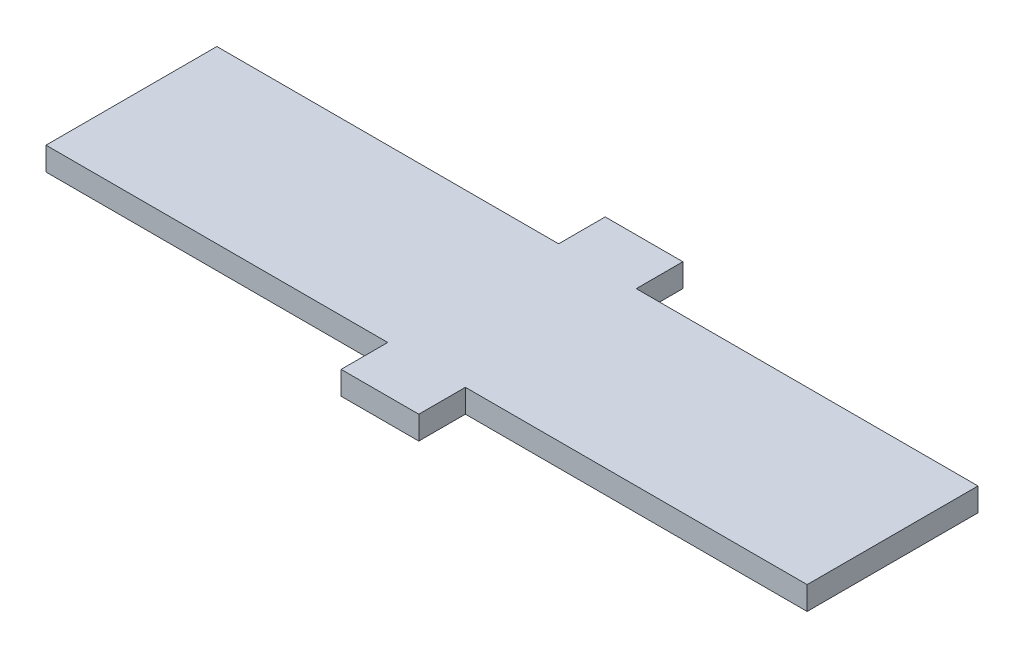
ISO-10303-21;
HEADER;
FILE_DESCRIPTION(('STEP AP214'),'2;1');
FILE_NAME('part.step','',(''),(''),'','','');
FILE_SCHEMA(('AUTOMOTIVE_DESIGN { 1 0 10303 214 1 1 1 1 }'));
ENDSEC;
DATA;
#1=APPLICATION_CONTEXT('core data for automotive mechanical design processes');
#2=APPLICATION_PROTOCOL_DEFINITION('international standard','automotive_design',2000,#1);
#3=PRODUCT_CONTEXT('',#1,'mechanical');
#4=PRODUCT('Part','Part','',(#3));
#5=PRODUCT_RELATED_PRODUCT_CATEGORY('part','',(#4));
#6=PRODUCT_DEFINITION_FORMATION('','',#4);
#7=PRODUCT_DEFINITION_CONTEXT('part definition',#1,'design');
#8=PRODUCT_DEFINITION('design','',#6,#7);
#9=PRODUCT_DEFINITION_SHAPE('','',#8);
#10=(LENGTH_UNIT() NAMED_UNIT(*) SI_UNIT(.MILLI.,.METRE.));
#11=(NAMED_UNIT(*) PLANE_ANGLE_UNIT() SI_UNIT($,.RADIAN.));
#12=(NAMED_UNIT(*) SI_UNIT($,.STERADIAN.) SOLID_ANGLE_UNIT());
#13=UNCERTAINTY_MEASURE_WITH_UNIT(LENGTH_MEASURE(1.E-05),#10,'distance_accuracy_value','');
#14=(GEOMETRIC_REPRESENTATION_CONTEXT(3) GLOBAL_UNCERTAINTY_ASSIGNED_CONTEXT((#13)) GLOBAL_UNIT_ASSIGNED_CONTEXT((#10,
#11,#12)) REPRESENTATION_CONTEXT('',''));
#15=CARTESIAN_POINT('',(0.,0.,0.));
#16=DIRECTION('',(0.,0.,1.));
#17=DIRECTION('',(1.,0.,0.));
#18=AXIS2_PLACEMENT_3D('',#15,#16,#17);
#19=CARTESIAN_POINT('',(-24.5,1.5,5.5));
#20=DIRECTION('',(0.,0.,-1.));
#21=DIRECTION('',(-1.,0.,0.));
#22=AXIS2_PLACEMENT_3D('',#19,#20,#21);
#23=PLANE('',#22);
#24=DIRECTION('',(0.,1.,0.));
#25=VECTOR('',#24,1.);
#26=CARTESIAN_POINT('',(2.49999999999999,0.,5.5));
#27=LINE('',#26,#25);
#28=CARTESIAN_POINT('',(2.49999999999999,0.,5.5));
#29=VERTEX_POINT('',#28);
#30=CARTESIAN_POINT('',(2.49999999999999,1.5,5.5));
#31=VERTEX_POINT('',#30);
#32=EDGE_CURVE('E160',#29,#31,#27,.T.);
#33=ORIENTED_EDGE('',*,*,#32,.F.);
#34=DIRECTION('',(1.,0.,0.));
#35=VECTOR('',#34,1.);
#36=CARTESIAN_POINT('',(-24.5,0.,5.5));
#37=LINE('',#36,#35);
#38=CARTESIAN_POINT('',(24.5,0.,5.5));
#39=VERTEX_POINT('',#38);
#40=EDGE_CURVE('E209',#29,#39,#37,.T.);
#41=ORIENTED_EDGE('',*,*,#40,.T.);
#42=DIRECTION('',(0.,-1.,0.));
#43=VECTOR('',#42,1.);
#44=CARTESIAN_POINT('',(24.5,1.5,5.5));
#45=LINE('',#44,#43);
#46=CARTESIAN_POINT('',(24.5,1.5,5.5));
#47=VERTEX_POINT('',#46);
#48=EDGE_CURVE('E200',#47,#39,#45,.T.);
#49=ORIENTED_EDGE('',*,*,#48,.F.);
#50=DIRECTION('',(1.,0.,0.));
#51=VECTOR('',#50,1.);
#52=CARTESIAN_POINT('',(-24.5,1.5,5.5));
#53=LINE('',#52,#51);
#54=EDGE_CURVE('E196',#31,#47,#53,.T.);
#55=ORIENTED_EDGE('',*,*,#54,.F.);
#56=EDGE_LOOP('',(#33,#41,#49,#55));
#57=FACE_BOUND('',#56,.T.);
#58=ADVANCED_FACE('F39',(#57),#23,.F.);
#59=CARTESIAN_POINT('',(-24.5,1.5,-5.5));
#60=DIRECTION('',(0.,0.,1.));
#61=DIRECTION('',(1.,0.,0.));
#62=AXIS2_PLACEMENT_3D('',#59,#60,#61);
#63=PLANE('',#62);
#64=DIRECTION('',(0.,1.,0.));
#65=VECTOR('',#64,1.);
#66=CARTESIAN_POINT('',(-2.50000000000001,0.,-5.5));
#67=LINE('',#66,#65);
#68=CARTESIAN_POINT('',(-2.50000000000001,0.,-5.5));
#69=VERTEX_POINT('',#68);
#70=CARTESIAN_POINT('',(-2.50000000000001,1.5,-5.5));
#71=VERTEX_POINT('',#70);
#72=EDGE_CURVE('E172',#69,#71,#67,.T.);
#73=ORIENTED_EDGE('',*,*,#72,.F.);
#74=DIRECTION('',(-1.,0.,0.));
#75=VECTOR('',#74,1.);
#76=CARTESIAN_POINT('',(-24.5,0.,-5.5));
#77=LINE('',#76,#75);
#78=CARTESIAN_POINT('',(-24.5,0.,-5.5));
#79=VERTEX_POINT('',#78);
#80=EDGE_CURVE('E203',#69,#79,#77,.T.);
#81=ORIENTED_EDGE('',*,*,#80,.T.);
#82=DIRECTION('',(0.,-1.,0.));
#83=VECTOR('',#82,1.);
#84=CARTESIAN_POINT('',(-24.5,1.5,-5.5));
#85=LINE('',#84,#83);
#86=CARTESIAN_POINT('',(-24.5,1.5,-5.5));
#87=VERTEX_POINT('',#86);
#88=EDGE_CURVE('E47',#87,#79,#85,.T.);
#89=ORIENTED_EDGE('',*,*,#88,.F.);
#90=DIRECTION('',(-1.,0.,0.));
#91=VECTOR('',#90,1.);
#92=CARTESIAN_POINT('',(-24.5,1.5,-5.5));
#93=LINE('',#92,#91);
#94=EDGE_CURVE('E189',#71,#87,#93,.T.);
#95=ORIENTED_EDGE('',*,*,#94,.F.);
#96=EDGE_LOOP('',(#73,#81,#89,#95));
#97=FACE_BOUND('',#96,.T.);
#98=ADVANCED_FACE('F233',(#97),#63,.F.);
#99=CARTESIAN_POINT('',(24.5,1.5,5.5));
#100=DIRECTION('',(-1.,0.,0.));
#101=DIRECTION('',(0.,0.,1.));
#102=AXIS2_PLACEMENT_3D('',#99,#100,#101);
#103=PLANE('',#102);
#104=DIRECTION('',(0.,0.,-1.));
#105=VECTOR('',#104,1.);
#106=CARTESIAN_POINT('',(24.5,0.,5.5));
#107=LINE('',#106,#105);
#108=CARTESIAN_POINT('',(24.5,0.,-5.5));
#109=VERTEX_POINT('',#108);
#110=EDGE_CURVE('E180',#39,#109,#107,.T.);
#111=ORIENTED_EDGE('',*,*,#110,.T.);
#112=DIRECTION('',(0.,-1.,0.));
#113=VECTOR('',#112,1.);
#114=CARTESIAN_POINT('',(24.5,1.5,-5.5));
#115=LINE('',#114,#113);
#116=CARTESIAN_POINT('',(24.5,1.5,-5.5));
#117=VERTEX_POINT('',#116);
#118=EDGE_CURVE('E11',#117,#109,#115,.T.);
#119=ORIENTED_EDGE('',*,*,#118,.F.);
#120=DIRECTION('',(0.,0.,-1.));
#121=VECTOR('',#120,1.);
#122=CARTESIAN_POINT('',(24.5,1.5,5.5));
#123=LINE('',#122,#121);
#124=EDGE_CURVE('E186',#47,#117,#123,.T.);
#125=ORIENTED_EDGE('',*,*,#124,.F.);
#126=ORIENTED_EDGE('',*,*,#48,.T.);
#127=EDGE_LOOP('',(#111,#119,#125,#126));
#128=FACE_BOUND('',#127,.T.);
#129=ADVANCED_FACE('F41',(#128),#103,.F.);
#130=CARTESIAN_POINT('',(2.49999999999999,0.,-5.5));
#131=VERTEX_POINT('',#130);
#132=EDGE_CURVE('E204',#109,#131,#77,.T.);
#133=ORIENTED_EDGE('',*,*,#132,.T.);
#134=DIRECTION('',(0.,1.,0.));
#135=VECTOR('',#134,1.);
#136=CARTESIAN_POINT('',(2.49999999999999,0.,-5.5));
#137=LINE('',#136,#135);
#138=CARTESIAN_POINT('',(2.49999999999999,1.5,-5.5));
#139=VERTEX_POINT('',#138);
#140=EDGE_CURVE('E183',#131,#139,#137,.T.);
#141=ORIENTED_EDGE('',*,*,#140,.T.);
#142=EDGE_CURVE('E191',#117,#139,#93,.T.);
#143=ORIENTED_EDGE('',*,*,#142,.F.);
#144=ORIENTED_EDGE('',*,*,#118,.T.);
#145=EDGE_LOOP('',(#133,#141,#143,#144));
#146=FACE_BOUND('',#145,.T.);
#147=ADVANCED_FACE('F243',(#146),#63,.F.);
#148=CARTESIAN_POINT('',(-24.5,1.5,5.5));
#149=DIRECTION('',(1.,0.,0.));
#150=DIRECTION('',(0.,0.,-1.));
#151=AXIS2_PLACEMENT_3D('',#148,#149,#150);
#152=PLANE('',#151);
#153=DIRECTION('',(0.,0.,1.));
#154=VECTOR('',#153,1.);
#155=CARTESIAN_POINT('',(-24.5,0.,5.5));
#156=LINE('',#155,#154);
#157=CARTESIAN_POINT('',(-24.5,0.,5.5));
#158=VERTEX_POINT('',#157);
#159=EDGE_CURVE('E207',#79,#158,#156,.T.);
#160=ORIENTED_EDGE('',*,*,#159,.T.);
#161=DIRECTION('',(0.,-1.,0.));
#162=VECTOR('',#161,1.);
#163=CARTESIAN_POINT('',(-24.5,1.5,5.5));
#164=LINE('',#163,#162);
#165=CARTESIAN_POINT('',(-24.5,1.5,5.5));
#166=VERTEX_POINT('',#165);
#167=EDGE_CURVE('E213',#166,#158,#164,.T.);
#168=ORIENTED_EDGE('',*,*,#167,.F.);
#169=DIRECTION('',(0.,0.,1.));
#170=VECTOR('',#169,1.);
#171=CARTESIAN_POINT('',(-24.5,1.5,5.5));
#172=LINE('',#171,#170);
#173=EDGE_CURVE('E194',#87,#166,#172,.T.);
#174=ORIENTED_EDGE('',*,*,#173,.F.);
#175=ORIENTED_EDGE('',*,*,#88,.T.);
#176=EDGE_LOOP('',(#160,#168,#174,#175));
#177=FACE_BOUND('',#176,.T.);
#178=ADVANCED_FACE('F220',(#177),#152,.F.);
#179=CARTESIAN_POINT('',(-2.50000000000001,0.,5.5));
#180=VERTEX_POINT('',#179);
#181=EDGE_CURVE('E190',#158,#180,#37,.T.);
#182=ORIENTED_EDGE('',*,*,#181,.T.);
#183=DIRECTION('',(0.,1.,0.));
#184=VECTOR('',#183,1.);
#185=CARTESIAN_POINT('',(-2.50000000000001,0.,5.5));
#186=LINE('',#185,#184);
#187=CARTESIAN_POINT('',(-2.50000000000001,1.5,5.5));
#188=VERTEX_POINT('',#187);
#189=EDGE_CURVE('E149',#180,#188,#186,.T.);
#190=ORIENTED_EDGE('',*,*,#189,.T.);
#191=EDGE_CURVE('E197',#166,#188,#53,.T.);
#192=ORIENTED_EDGE('',*,*,#191,.F.);
#193=ORIENTED_EDGE('',*,*,#167,.T.);
#194=EDGE_LOOP('',(#182,#190,#192,#193));
#195=FACE_BOUND('',#194,.T.);
#196=ADVANCED_FACE('F227',(#195),#23,.F.);
#197=CARTESIAN_POINT('',(0.,1.5,0.));
#198=DIRECTION('',(0.,-1.,0.));
#199=DIRECTION('',(0.,0.,-1.));
#200=AXIS2_PLACEMENT_3D('',#197,#198,#199);
#201=PLANE('',#200);
#202=ORIENTED_EDGE('',*,*,#124,.T.);
#203=ORIENTED_EDGE('',*,*,#142,.T.);
#204=DIRECTION('',(0.,0.,-1.));
#205=VECTOR('',#204,1.);
#206=CARTESIAN_POINT('',(2.49999999999999,1.5,-5.5));
#207=LINE('',#206,#205);
#208=CARTESIAN_POINT('',(2.49999999999999,1.5,-8.5));
#209=VERTEX_POINT('',#208);
#210=EDGE_CURVE('E62',#139,#209,#207,.T.);
#211=ORIENTED_EDGE('',*,*,#210,.T.);
#212=DIRECTION('',(-1.,0.,0.));
#213=VECTOR('',#212,1.);
#214=CARTESIAN_POINT('',(-2.50000000000001,1.5,-8.5));
#215=LINE('',#214,#213);
#216=CARTESIAN_POINT('',(-2.50000000000001,1.5,-8.5));
#217=VERTEX_POINT('',#216);
#218=EDGE_CURVE('E166',#209,#217,#215,.T.);
#219=ORIENTED_EDGE('',*,*,#218,.T.);
#220=DIRECTION('',(0.,0.,1.));
#221=VECTOR('',#220,1.);
#222=CARTESIAN_POINT('',(-2.50000000000001,1.5,-5.5));
#223=LINE('',#222,#221);
#224=EDGE_CURVE('E159',#217,#71,#223,.T.);
#225=ORIENTED_EDGE('',*,*,#224,.T.);
#226=ORIENTED_EDGE('',*,*,#94,.T.);
#227=ORIENTED_EDGE('',*,*,#173,.T.);
#228=ORIENTED_EDGE('',*,*,#191,.T.);
#229=DIRECTION('',(0.,0.,1.));
#230=VECTOR('',#229,1.);
#231=CARTESIAN_POINT('',(-2.50000000000001,1.5,5.5));
#232=LINE('',#231,#230);
#233=CARTESIAN_POINT('',(-2.50000000000001,1.5,8.5));
#234=VERTEX_POINT('',#233);
#235=EDGE_CURVE('E54',#188,#234,#232,.T.);
#236=ORIENTED_EDGE('',*,*,#235,.T.);
#237=DIRECTION('',(1.,0.,0.));
#238=VECTOR('',#237,1.);
#239=CARTESIAN_POINT('',(-2.50000000000001,1.5,8.5));
#240=LINE('',#239,#238);
#241=CARTESIAN_POINT('',(2.49999999999999,1.5,8.5));
#242=VERTEX_POINT('',#241);
#243=EDGE_CURVE('E133',#234,#242,#240,.T.);
#244=ORIENTED_EDGE('',*,*,#243,.T.);
#245=DIRECTION('',(0.,0.,-1.));
#246=VECTOR('',#245,1.);
#247=CARTESIAN_POINT('',(2.49999999999999,1.5,5.5));
#248=LINE('',#247,#246);
#249=EDGE_CURVE('E150',#242,#31,#248,.T.);
#250=ORIENTED_EDGE('',*,*,#249,.T.);
#251=ORIENTED_EDGE('',*,*,#54,.T.);
#252=EDGE_LOOP('',(#202,#203,#211,#219,#225,#226,#227,#228,#236,#244,#250,#251));
#253=FACE_BOUND('',#252,.T.);
#254=ADVANCED_FACE('F230',(#253),#201,.F.);
#255=CARTESIAN_POINT('',(0.,0.,0.));
#256=DIRECTION('',(0.,-1.,0.));
#257=DIRECTION('',(0.,0.,-1.));
#258=AXIS2_PLACEMENT_3D('',#255,#256,#257);
#259=PLANE('',#258);
#260=ORIENTED_EDGE('',*,*,#110,.F.);
#261=ORIENTED_EDGE('',*,*,#40,.F.);
#262=DIRECTION('',(0.,0.,-1.));
#263=VECTOR('',#262,1.);
#264=CARTESIAN_POINT('',(2.49999999999999,0.,5.5));
#265=LINE('',#264,#263);
#266=CARTESIAN_POINT('',(2.49999999999999,0.,8.5));
#267=VERTEX_POINT('',#266);
#268=EDGE_CURVE('E136',#267,#29,#265,.T.);
#269=ORIENTED_EDGE('',*,*,#268,.F.);
#270=DIRECTION('',(1.,0.,0.));
#271=VECTOR('',#270,1.);
#272=CARTESIAN_POINT('',(-2.50000000000001,0.,8.5));
#273=LINE('',#272,#271);
#274=CARTESIAN_POINT('',(-2.50000000000001,0.,8.5));
#275=VERTEX_POINT('',#274);
#276=EDGE_CURVE('E131',#275,#267,#273,.T.);
#277=ORIENTED_EDGE('',*,*,#276,.F.);
#278=DIRECTION('',(0.,0.,1.));
#279=VECTOR('',#278,1.);
#280=CARTESIAN_POINT('',(-2.50000000000001,0.,5.5));
#281=LINE('',#280,#279);
#282=EDGE_CURVE('E144',#180,#275,#281,.T.);
#283=ORIENTED_EDGE('',*,*,#282,.F.);
#284=ORIENTED_EDGE('',*,*,#181,.F.);
#285=ORIENTED_EDGE('',*,*,#159,.F.);
#286=ORIENTED_EDGE('',*,*,#80,.F.);
#287=DIRECTION('',(0.,0.,1.));
#288=VECTOR('',#287,1.);
#289=CARTESIAN_POINT('',(-2.50000000000001,0.,-5.5));
#290=LINE('',#289,#288);
#291=CARTESIAN_POINT('',(-2.50000000000001,0.,-8.5));
#292=VERTEX_POINT('',#291);
#293=EDGE_CURVE('E163',#292,#69,#290,.T.);
#294=ORIENTED_EDGE('',*,*,#293,.F.);
#295=DIRECTION('',(-1.,0.,0.));
#296=VECTOR('',#295,1.);
#297=CARTESIAN_POINT('',(-2.50000000000001,0.,-8.5));
#298=LINE('',#297,#296);
#299=CARTESIAN_POINT('',(2.49999999999999,0.,-8.5));
#300=VERTEX_POINT('',#299);
#301=EDGE_CURVE('E169',#300,#292,#298,.T.);
#302=ORIENTED_EDGE('',*,*,#301,.F.);
#303=DIRECTION('',(0.,0.,-1.));
#304=VECTOR('',#303,1.);
#305=CARTESIAN_POINT('',(2.49999999999999,0.,-5.5));
#306=LINE('',#305,#304);
#307=EDGE_CURVE('E165',#131,#300,#306,.T.);
#308=ORIENTED_EDGE('',*,*,#307,.F.);
#309=ORIENTED_EDGE('',*,*,#132,.F.);
#310=EDGE_LOOP('',(#260,#261,#269,#277,#283,#284,#285,#286,#294,#302,#308,#309));
#311=FACE_BOUND('',#310,.T.);
#312=ADVANCED_FACE('F142',(#311),#259,.T.);
#313=CARTESIAN_POINT('',(-2.50000000000001,0.,-5.5));
#314=DIRECTION('',(-1.,0.,0.));
#315=DIRECTION('',(0.,0.,1.));
#316=AXIS2_PLACEMENT_3D('',#313,#314,#315);
#317=PLANE('',#316);
#318=ORIENTED_EDGE('',*,*,#224,.F.);
#319=DIRECTION('',(0.,1.,0.));
#320=VECTOR('',#319,1.);
#321=CARTESIAN_POINT('',(-2.50000000000001,0.,-8.5));
#322=LINE('',#321,#320);
#323=EDGE_CURVE('E178',#292,#217,#322,.T.);
#324=ORIENTED_EDGE('',*,*,#323,.F.);
#325=ORIENTED_EDGE('',*,*,#293,.T.);
#326=ORIENTED_EDGE('',*,*,#72,.T.);
#327=EDGE_LOOP('',(#318,#324,#325,#326));
#328=FACE_BOUND('',#327,.T.);
#329=ADVANCED_FACE('F235',(#328),#317,.T.);
#330=CARTESIAN_POINT('',(-2.50000000000001,0.,-8.5));
#331=DIRECTION('',(0.,0.,-1.));
#332=DIRECTION('',(-1.,0.,0.));
#333=AXIS2_PLACEMENT_3D('',#330,#331,#332);
#334=PLANE('',#333);
#335=ORIENTED_EDGE('',*,*,#218,.F.);
#336=DIRECTION('',(0.,1.,0.));
#337=VECTOR('',#336,1.);
#338=CARTESIAN_POINT('',(2.49999999999999,0.,-8.5));
#339=LINE('',#338,#337);
#340=EDGE_CURVE('E181',#300,#209,#339,.T.);
#341=ORIENTED_EDGE('',*,*,#340,.F.);
#342=ORIENTED_EDGE('',*,*,#301,.T.);
#343=ORIENTED_EDGE('',*,*,#323,.T.);
#344=EDGE_LOOP('',(#335,#341,#342,#343));
#345=FACE_BOUND('',#344,.T.);
#346=ADVANCED_FACE('F240',(#345),#334,.T.);
#347=CARTESIAN_POINT('',(2.49999999999999,0.,-5.5));
#348=DIRECTION('',(1.,0.,0.));
#349=DIRECTION('',(0.,0.,-1.));
#350=AXIS2_PLACEMENT_3D('',#347,#348,#349);
#351=PLANE('',#350);
#352=ORIENTED_EDGE('',*,*,#210,.F.);
#353=ORIENTED_EDGE('',*,*,#140,.F.);
#354=ORIENTED_EDGE('',*,*,#307,.T.);
#355=ORIENTED_EDGE('',*,*,#340,.T.);
#356=EDGE_LOOP('',(#352,#353,#354,#355));
#357=FACE_BOUND('',#356,.T.);
#358=ADVANCED_FACE('F241',(#357),#351,.T.);
#359=CARTESIAN_POINT('',(-2.50000000000001,0.,5.5));
#360=DIRECTION('',(-1.,0.,0.));
#361=DIRECTION('',(0.,0.,1.));
#362=AXIS2_PLACEMENT_3D('',#359,#360,#361);
#363=PLANE('',#362);
#364=ORIENTED_EDGE('',*,*,#235,.F.);
#365=ORIENTED_EDGE('',*,*,#189,.F.);
#366=ORIENTED_EDGE('',*,*,#282,.T.);
#367=DIRECTION('',(0.,1.,0.));
#368=VECTOR('',#367,1.);
#369=CARTESIAN_POINT('',(-2.50000000000001,0.,8.5));
#370=LINE('',#369,#368);
#371=EDGE_CURVE('E128',#275,#234,#370,.T.);
#372=ORIENTED_EDGE('',*,*,#371,.T.);
#373=EDGE_LOOP('',(#364,#365,#366,#372));
#374=FACE_BOUND('',#373,.T.);
#375=ADVANCED_FACE('F148',(#374),#363,.T.);
#376=CARTESIAN_POINT('',(2.49999999999999,0.,5.5));
#377=DIRECTION('',(1.,0.,0.));
#378=DIRECTION('',(0.,0.,-1.));
#379=AXIS2_PLACEMENT_3D('',#376,#377,#378);
#380=PLANE('',#379);
#381=ORIENTED_EDGE('',*,*,#249,.F.);
#382=DIRECTION('',(0.,1.,0.));
#383=VECTOR('',#382,1.);
#384=CARTESIAN_POINT('',(2.49999999999999,0.,8.5));
#385=LINE('',#384,#383);
#386=EDGE_CURVE('E135',#267,#242,#385,.T.);
#387=ORIENTED_EDGE('',*,*,#386,.F.);
#388=ORIENTED_EDGE('',*,*,#268,.T.);
#389=ORIENTED_EDGE('',*,*,#32,.T.);
#390=EDGE_LOOP('',(#381,#387,#388,#389));
#391=FACE_BOUND('',#390,.T.);
#392=ADVANCED_FACE('F253',(#391),#380,.T.);
#393=CARTESIAN_POINT('',(-2.50000000000001,0.,8.5));
#394=DIRECTION('',(0.,0.,1.));
#395=DIRECTION('',(1.,0.,0.));
#396=AXIS2_PLACEMENT_3D('',#393,#394,#395);
#397=PLANE('',#396);
#398=ORIENTED_EDGE('',*,*,#243,.F.);
#399=ORIENTED_EDGE('',*,*,#371,.F.);
#400=ORIENTED_EDGE('',*,*,#276,.T.);
#401=ORIENTED_EDGE('',*,*,#386,.T.);
#402=EDGE_LOOP('',(#398,#399,#400,#401));
#403=FACE_BOUND('',#402,.T.);
#404=ADVANCED_FACE('F130',(#403),#397,.T.);
#405=CLOSED_SHELL('',(#58,#98,#129,#147,#178,#196,#254,#312,#329,#346,#358,#375,#392,#404));
#406=MANIFOLD_SOLID_BREP('B2',#405);
#407=ADVANCED_BREP_SHAPE_REPRESENTATION('',(#18,#406),#14);
#408=SHAPE_DEFINITION_REPRESENTATION(#9,#407);
ENDSEC;
END-ISO-10303-21;
